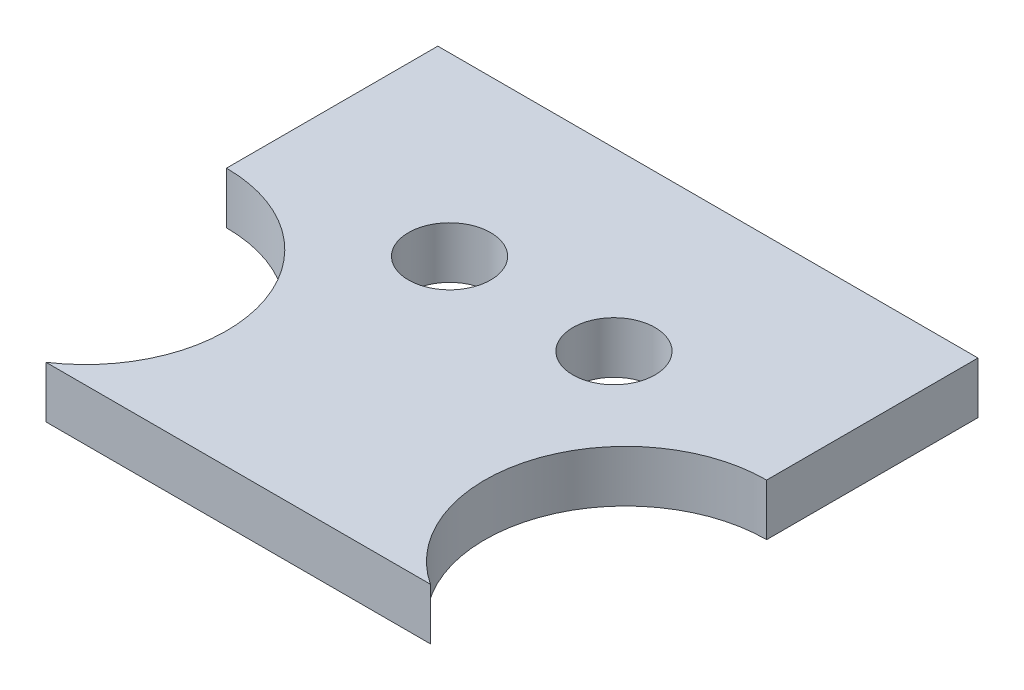
ISO-10303-21;
HEADER;
FILE_DESCRIPTION(('STEP AP214'),'2;1');
FILE_NAME('part.step','',(''),(''),'','','');
FILE_SCHEMA(('AUTOMOTIVE_DESIGN { 1 0 10303 214 1 1 1 1 }'));
ENDSEC;
DATA;
#1=APPLICATION_CONTEXT('core data for automotive mechanical design processes');
#2=APPLICATION_PROTOCOL_DEFINITION('international standard','automotive_design',2000,#1);
#3=PRODUCT_CONTEXT('',#1,'mechanical');
#4=PRODUCT('Part','Part','',(#3));
#5=PRODUCT_RELATED_PRODUCT_CATEGORY('part','',(#4));
#6=PRODUCT_DEFINITION_FORMATION('','',#4);
#7=PRODUCT_DEFINITION_CONTEXT('part definition',#1,'design');
#8=PRODUCT_DEFINITION('design','',#6,#7);
#9=PRODUCT_DEFINITION_SHAPE('','',#8);
#10=(LENGTH_UNIT() NAMED_UNIT(*) SI_UNIT(.MILLI.,.METRE.));
#11=(NAMED_UNIT(*) PLANE_ANGLE_UNIT() SI_UNIT($,.RADIAN.));
#12=(NAMED_UNIT(*) SI_UNIT($,.STERADIAN.) SOLID_ANGLE_UNIT());
#13=UNCERTAINTY_MEASURE_WITH_UNIT(LENGTH_MEASURE(1.E-05),#10,'distance_accuracy_value','');
#14=(GEOMETRIC_REPRESENTATION_CONTEXT(3) GLOBAL_UNCERTAINTY_ASSIGNED_CONTEXT((#13)) GLOBAL_UNIT_ASSIGNED_CONTEXT((#10,
#11,#12)) REPRESENTATION_CONTEXT('',''));
#15=CARTESIAN_POINT('',(0.,0.,0.));
#16=DIRECTION('',(0.,0.,1.));
#17=DIRECTION('',(1.,0.,0.));
#18=AXIS2_PLACEMENT_3D('',#15,#16,#17);
#19=CARTESIAN_POINT('',(23.,4.4,15.));
#20=DIRECTION('',(0.,1.,0.));
#21=DIRECTION('',(0.,0.,1.));
#22=AXIS2_PLACEMENT_3D('',#19,#20,#21);
#23=PLANE('',#22);
#24=CARTESIAN_POINT('',(-7.,4.4,0.));
#25=DIRECTION('',(0.,1.,0.));
#26=DIRECTION('',(0.,0.,1.));
#27=AXIS2_PLACEMENT_3D('',#24,#25,#26);
#28=CIRCLE('',#27,3.5);
#29=CARTESIAN_POINT('',(-7.,4.4,3.5));
#30=VERTEX_POINT('',#29);
#31=EDGE_CURVE('E141',#30,#30,#28,.T.);
#32=ORIENTED_EDGE('',*,*,#31,.F.);
#33=EDGE_LOOP('',(#32));
#34=FACE_BOUND('',#33,.T.);
#35=DIRECTION('',(0.,0.,1.));
#36=VECTOR('',#35,1.);
#37=CARTESIAN_POINT('',(-23.,4.4,3.));
#38=LINE('',#37,#36);
#39=CARTESIAN_POINT('',(-23.,4.4,-15.));
#40=VERTEX_POINT('',#39);
#41=CARTESIAN_POINT('',(-23.,4.4,3.));
#42=VERTEX_POINT('',#41);
#43=EDGE_CURVE('E154',#40,#42,#38,.T.);
#44=ORIENTED_EDGE('',*,*,#43,.T.);
#45=CARTESIAN_POINT('',(-23.,4.4,15.));
#46=DIRECTION('',(0.,-1.,0.));
#47=DIRECTION('',(0.,0.,-1.));
#48=AXIS2_PLACEMENT_3D('',#45,#46,#47);
#49=CIRCLE('',#48,12.);
#50=CARTESIAN_POINT('',(-16.3667504192892,4.4,25.));
#51=VERTEX_POINT('',#50);
#52=EDGE_CURVE('E102',#42,#51,#49,.T.);
#53=ORIENTED_EDGE('',*,*,#52,.T.);
#54=DIRECTION('',(1.,0.,0.));
#55=VECTOR('',#54,1.);
#56=CARTESIAN_POINT('',(-16.3667504192892,4.4,25.));
#57=LINE('',#56,#55);
#58=CARTESIAN_POINT('',(16.3667504192892,4.4,25.));
#59=VERTEX_POINT('',#58);
#60=EDGE_CURVE('E115',#51,#59,#57,.T.);
#61=ORIENTED_EDGE('',*,*,#60,.T.);
#62=CARTESIAN_POINT('',(23.,4.4,15.));
#63=DIRECTION('',(0.,-1.,0.));
#64=DIRECTION('',(0.,0.,1.));
#65=AXIS2_PLACEMENT_3D('',#62,#63,#64);
#66=CIRCLE('',#65,12.);
#67=CARTESIAN_POINT('',(23.,4.4,3.));
#68=VERTEX_POINT('',#67);
#69=EDGE_CURVE('E109',#59,#68,#66,.T.);
#70=ORIENTED_EDGE('',*,*,#69,.T.);
#71=DIRECTION('',(0.,0.,-1.));
#72=VECTOR('',#71,1.);
#73=CARTESIAN_POINT('',(23.,4.4,-15.));
#74=LINE('',#73,#72);
#75=CARTESIAN_POINT('',(23.,4.4,-15.));
#76=VERTEX_POINT('',#75);
#77=EDGE_CURVE('E113',#68,#76,#74,.T.);
#78=ORIENTED_EDGE('',*,*,#77,.T.);
#79=DIRECTION('',(-1.,0.,0.));
#80=VECTOR('',#79,1.);
#81=CARTESIAN_POINT('',(-23.,4.4,-15.));
#82=LINE('',#81,#80);
#83=EDGE_CURVE('E65',#76,#40,#82,.T.);
#84=ORIENTED_EDGE('',*,*,#83,.T.);
#85=EDGE_LOOP('',(#44,#53,#61,#70,#78,#84));
#86=FACE_BOUND('',#85,.T.);
#87=CARTESIAN_POINT('',(7.,4.4,0.));
#88=DIRECTION('',(0.,1.,0.));
#89=DIRECTION('',(0.,0.,1.));
#90=AXIS2_PLACEMENT_3D('',#87,#88,#89);
#91=CIRCLE('',#90,3.5);
#92=CARTESIAN_POINT('',(7.,4.4,3.5));
#93=VERTEX_POINT('',#92);
#94=EDGE_CURVE('E200',#93,#93,#91,.T.);
#95=ORIENTED_EDGE('',*,*,#94,.F.);
#96=EDGE_LOOP('',(#95));
#97=FACE_BOUND('',#96,.T.);
#98=ADVANCED_FACE('F47',(#34,#86,#97),#23,.T.);
#99=CARTESIAN_POINT('',(23.,0.,15.));
#100=DIRECTION('',(0.,1.,0.));
#101=DIRECTION('',(0.,0.,1.));
#102=AXIS2_PLACEMENT_3D('',#99,#100,#101);
#103=PLANE('',#102);
#104=DIRECTION('',(0.,0.,1.));
#105=VECTOR('',#104,1.);
#106=CARTESIAN_POINT('',(-23.,0.,3.));
#107=LINE('',#106,#105);
#108=CARTESIAN_POINT('',(-23.,0.,-15.));
#109=VERTEX_POINT('',#108);
#110=CARTESIAN_POINT('',(-23.,0.,3.));
#111=VERTEX_POINT('',#110);
#112=EDGE_CURVE('E136',#109,#111,#107,.T.);
#113=ORIENTED_EDGE('',*,*,#112,.F.);
#114=DIRECTION('',(-1.,0.,0.));
#115=VECTOR('',#114,1.);
#116=CARTESIAN_POINT('',(-23.,0.,-15.));
#117=LINE('',#116,#115);
#118=CARTESIAN_POINT('',(23.,0.,-15.));
#119=VERTEX_POINT('',#118);
#120=EDGE_CURVE('E94',#119,#109,#117,.T.);
#121=ORIENTED_EDGE('',*,*,#120,.F.);
#122=DIRECTION('',(0.,0.,-1.));
#123=VECTOR('',#122,1.);
#124=CARTESIAN_POINT('',(23.,0.,-15.));
#125=LINE('',#124,#123);
#126=CARTESIAN_POINT('',(23.,0.,3.));
#127=VERTEX_POINT('',#126);
#128=EDGE_CURVE('E88',#127,#119,#125,.T.);
#129=ORIENTED_EDGE('',*,*,#128,.F.);
#130=CARTESIAN_POINT('',(23.,0.,15.));
#131=DIRECTION('',(0.,-1.,0.));
#132=DIRECTION('',(0.,0.,1.));
#133=AXIS2_PLACEMENT_3D('',#130,#131,#132);
#134=CIRCLE('',#133,12.);
#135=CARTESIAN_POINT('',(16.3667504192892,0.,25.));
#136=VERTEX_POINT('',#135);
#137=EDGE_CURVE('E123',#136,#127,#134,.T.);
#138=ORIENTED_EDGE('',*,*,#137,.F.);
#139=DIRECTION('',(1.,0.,0.));
#140=VECTOR('',#139,1.);
#141=CARTESIAN_POINT('',(-16.3667504192892,0.,25.));
#142=LINE('',#141,#140);
#143=CARTESIAN_POINT('',(-16.3667504192892,0.,25.));
#144=VERTEX_POINT('',#143);
#145=EDGE_CURVE('E144',#144,#136,#142,.T.);
#146=ORIENTED_EDGE('',*,*,#145,.F.);
#147=CARTESIAN_POINT('',(-23.,0.,15.));
#148=DIRECTION('',(0.,-1.,0.));
#149=DIRECTION('',(0.,0.,-1.));
#150=AXIS2_PLACEMENT_3D('',#147,#148,#149);
#151=CIRCLE('',#150,12.);
#152=EDGE_CURVE('E140',#111,#144,#151,.T.);
#153=ORIENTED_EDGE('',*,*,#152,.F.);
#154=EDGE_LOOP('',(#113,#121,#129,#138,#146,#153));
#155=FACE_BOUND('',#154,.T.);
#156=CARTESIAN_POINT('',(-7.,0.,0.));
#157=DIRECTION('',(0.,1.,0.));
#158=DIRECTION('',(0.,0.,1.));
#159=AXIS2_PLACEMENT_3D('',#156,#157,#158);
#160=CIRCLE('',#159,3.5);
#161=CARTESIAN_POINT('',(-7.,0.,3.5));
#162=VERTEX_POINT('',#161);
#163=EDGE_CURVE('E208',#162,#162,#160,.T.);
#164=ORIENTED_EDGE('',*,*,#163,.T.);
#165=EDGE_LOOP('',(#164));
#166=FACE_BOUND('',#165,.T.);
#167=CARTESIAN_POINT('',(7.,0.,0.));
#168=DIRECTION('',(0.,1.,0.));
#169=DIRECTION('',(0.,0.,1.));
#170=AXIS2_PLACEMENT_3D('',#167,#168,#169);
#171=CIRCLE('',#170,3.5);
#172=CARTESIAN_POINT('',(7.,0.,3.5));
#173=VERTEX_POINT('',#172);
#174=EDGE_CURVE('E203',#173,#173,#171,.T.);
#175=ORIENTED_EDGE('',*,*,#174,.T.);
#176=EDGE_LOOP('',(#175));
#177=FACE_BOUND('',#176,.T.);
#178=ADVANCED_FACE('F167',(#155,#166,#177),#103,.F.);
#179=CARTESIAN_POINT('',(-23.,4.4,3.));
#180=DIRECTION('',(1.,0.,0.));
#181=DIRECTION('',(0.,0.,-1.));
#182=AXIS2_PLACEMENT_3D('',#179,#180,#181);
#183=PLANE('',#182);
#184=ORIENTED_EDGE('',*,*,#112,.T.);
#185=DIRECTION('',(0.,-1.,0.));
#186=VECTOR('',#185,1.);
#187=CARTESIAN_POINT('',(-23.,4.4,3.));
#188=LINE('',#187,#186);
#189=EDGE_CURVE('E11',#42,#111,#188,.T.);
#190=ORIENTED_EDGE('',*,*,#189,.F.);
#191=ORIENTED_EDGE('',*,*,#43,.F.);
#192=DIRECTION('',(0.,-1.,0.));
#193=VECTOR('',#192,1.);
#194=CARTESIAN_POINT('',(-23.,4.4,-15.));
#195=LINE('',#194,#193);
#196=EDGE_CURVE('E132',#40,#109,#195,.T.);
#197=ORIENTED_EDGE('',*,*,#196,.T.);
#198=EDGE_LOOP('',(#184,#190,#191,#197));
#199=FACE_BOUND('',#198,.T.);
#200=ADVANCED_FACE('F49',(#199),#183,.F.);
#201=CARTESIAN_POINT('',(-23.,4.4,15.));
#202=DIRECTION('',(0.,-1.,0.));
#203=DIRECTION('',(0.,0.,-1.));
#204=AXIS2_PLACEMENT_3D('',#201,#202,#203);
#205=CYLINDRICAL_SURFACE('',#204,12.);
#206=ORIENTED_EDGE('',*,*,#152,.T.);
#207=DIRECTION('',(0.,-1.,0.));
#208=VECTOR('',#207,1.);
#209=CARTESIAN_POINT('',(-16.3667504192892,4.4,25.));
#210=LINE('',#209,#208);
#211=EDGE_CURVE('E57',#51,#144,#210,.T.);
#212=ORIENTED_EDGE('',*,*,#211,.F.);
#213=ORIENTED_EDGE('',*,*,#52,.F.);
#214=ORIENTED_EDGE('',*,*,#189,.T.);
#215=EDGE_LOOP('',(#206,#212,#213,#214));
#216=FACE_BOUND('',#215,.T.);
#217=ADVANCED_FACE('F256',(#216),#205,.F.);
#218=CARTESIAN_POINT('',(-16.3667504192892,4.4,25.));
#219=DIRECTION('',(0.,0.,-1.));
#220=DIRECTION('',(-1.,0.,0.));
#221=AXIS2_PLACEMENT_3D('',#218,#219,#220);
#222=PLANE('',#221);
#223=ORIENTED_EDGE('',*,*,#145,.T.);
#224=DIRECTION('',(0.,-1.,0.));
#225=VECTOR('',#224,1.);
#226=CARTESIAN_POINT('',(16.3667504192892,4.4,25.));
#227=LINE('',#226,#225);
#228=EDGE_CURVE('E125',#59,#136,#227,.T.);
#229=ORIENTED_EDGE('',*,*,#228,.F.);
#230=ORIENTED_EDGE('',*,*,#60,.F.);
#231=ORIENTED_EDGE('',*,*,#211,.T.);
#232=EDGE_LOOP('',(#223,#229,#230,#231));
#233=FACE_BOUND('',#232,.T.);
#234=ADVANCED_FACE('F164',(#233),#222,.F.);
#235=CARTESIAN_POINT('',(23.,4.4,15.));
#236=DIRECTION('',(0.,-1.,0.));
#237=DIRECTION('',(0.,0.,-1.));
#238=AXIS2_PLACEMENT_3D('',#235,#236,#237);
#239=CYLINDRICAL_SURFACE('',#238,12.);
#240=ORIENTED_EDGE('',*,*,#137,.T.);
#241=DIRECTION('',(0.,-1.,0.));
#242=VECTOR('',#241,1.);
#243=CARTESIAN_POINT('',(23.,4.4,3.));
#244=LINE('',#243,#242);
#245=EDGE_CURVE('E121',#68,#127,#244,.T.);
#246=ORIENTED_EDGE('',*,*,#245,.F.);
#247=ORIENTED_EDGE('',*,*,#69,.F.);
#248=ORIENTED_EDGE('',*,*,#228,.T.);
#249=EDGE_LOOP('',(#240,#246,#247,#248));
#250=FACE_BOUND('',#249,.T.);
#251=ADVANCED_FACE('F122',(#250),#239,.F.);
#252=CARTESIAN_POINT('',(23.,4.4,-15.));
#253=DIRECTION('',(-1.,0.,0.));
#254=DIRECTION('',(0.,0.,1.));
#255=AXIS2_PLACEMENT_3D('',#252,#253,#254);
#256=PLANE('',#255);
#257=ORIENTED_EDGE('',*,*,#128,.T.);
#258=DIRECTION('',(0.,-1.,0.));
#259=VECTOR('',#258,1.);
#260=CARTESIAN_POINT('',(23.,4.4,-15.));
#261=LINE('',#260,#259);
#262=EDGE_CURVE('E126',#76,#119,#261,.T.);
#263=ORIENTED_EDGE('',*,*,#262,.F.);
#264=ORIENTED_EDGE('',*,*,#77,.F.);
#265=ORIENTED_EDGE('',*,*,#245,.T.);
#266=EDGE_LOOP('',(#257,#263,#264,#265));
#267=FACE_BOUND('',#266,.T.);
#268=ADVANCED_FACE('F128',(#267),#256,.F.);
#269=CARTESIAN_POINT('',(-23.,4.4,-15.));
#270=DIRECTION('',(0.,0.,1.));
#271=DIRECTION('',(1.,0.,0.));
#272=AXIS2_PLACEMENT_3D('',#269,#270,#271);
#273=PLANE('',#272);
#274=ORIENTED_EDGE('',*,*,#120,.T.);
#275=ORIENTED_EDGE('',*,*,#196,.F.);
#276=ORIENTED_EDGE('',*,*,#83,.F.);
#277=ORIENTED_EDGE('',*,*,#262,.T.);
#278=EDGE_LOOP('',(#274,#275,#276,#277));
#279=FACE_BOUND('',#278,.T.);
#280=ADVANCED_FACE('F172',(#279),#273,.F.);
#281=CARTESIAN_POINT('',(-7.,4.4,0.));
#282=DIRECTION('',(0.,-1.,0.));
#283=DIRECTION('',(0.,0.,-1.));
#284=AXIS2_PLACEMENT_3D('',#281,#282,#283);
#285=CYLINDRICAL_SURFACE('',#284,3.5);
#286=ORIENTED_EDGE('',*,*,#31,.T.);
#287=EDGE_LOOP('',(#286));
#288=FACE_BOUND('',#287,.T.);
#289=ORIENTED_EDGE('',*,*,#163,.F.);
#290=EDGE_LOOP('',(#289));
#291=FACE_BOUND('',#290,.T.);
#292=ADVANCED_FACE('F174',(#288,#291),#285,.F.);
#293=CARTESIAN_POINT('',(7.,4.4,0.));
#294=DIRECTION('',(0.,-1.,0.));
#295=DIRECTION('',(0.,0.,-1.));
#296=AXIS2_PLACEMENT_3D('',#293,#294,#295);
#297=CYLINDRICAL_SURFACE('',#296,3.5);
#298=ORIENTED_EDGE('',*,*,#94,.T.);
#299=EDGE_LOOP('',(#298));
#300=FACE_BOUND('',#299,.T.);
#301=ORIENTED_EDGE('',*,*,#174,.F.);
#302=EDGE_LOOP('',(#301));
#303=FACE_BOUND('',#302,.T.);
#304=ADVANCED_FACE('F180',(#300,#303),#297,.F.);
#305=CLOSED_SHELL('',(#98,#178,#200,#217,#234,#251,#268,#280,#292,#304));
#306=MANIFOLD_SOLID_BREP('B2',#305);
#307=ADVANCED_BREP_SHAPE_REPRESENTATION('',(#18,#306),#14);
#308=SHAPE_DEFINITION_REPRESENTATION(#9,#307);
ENDSEC;
END-ISO-10303-21;
